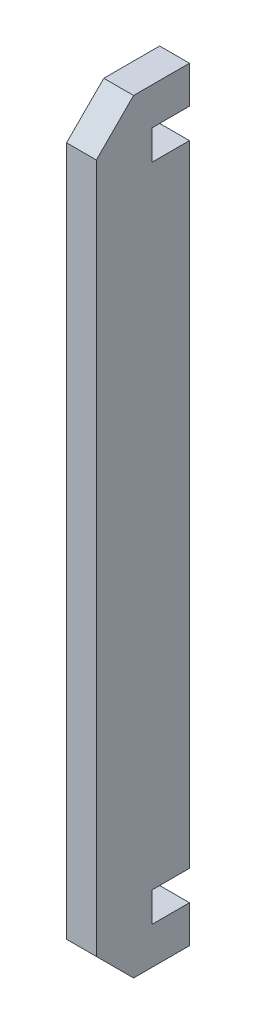
ISO-10303-21;
HEADER;
FILE_DESCRIPTION(('STEP AP214'),'2;1');
FILE_NAME('part.step','',(''),(''),'','','');
FILE_SCHEMA(('AUTOMOTIVE_DESIGN { 1 0 10303 214 1 1 1 1 }'));
ENDSEC;
DATA;
#1=APPLICATION_CONTEXT('core data for automotive mechanical design processes');
#2=APPLICATION_PROTOCOL_DEFINITION('international standard','automotive_design',2000,#1);
#3=PRODUCT_CONTEXT('',#1,'mechanical');
#4=PRODUCT('Part','Part','',(#3));
#5=PRODUCT_RELATED_PRODUCT_CATEGORY('part','',(#4));
#6=PRODUCT_DEFINITION_FORMATION('','',#4);
#7=PRODUCT_DEFINITION_CONTEXT('part definition',#1,'design');
#8=PRODUCT_DEFINITION('design','',#6,#7);
#9=PRODUCT_DEFINITION_SHAPE('','',#8);
#10=(LENGTH_UNIT() NAMED_UNIT(*) SI_UNIT(.MILLI.,.METRE.));
#11=(NAMED_UNIT(*) PLANE_ANGLE_UNIT() SI_UNIT($,.RADIAN.));
#12=(NAMED_UNIT(*) SI_UNIT($,.STERADIAN.) SOLID_ANGLE_UNIT());
#13=UNCERTAINTY_MEASURE_WITH_UNIT(LENGTH_MEASURE(1.E-05),#10,'distance_accuracy_value','');
#14=(GEOMETRIC_REPRESENTATION_CONTEXT(3) GLOBAL_UNCERTAINTY_ASSIGNED_CONTEXT((#13)) GLOBAL_UNIT_ASSIGNED_CONTEXT((#10,
#11,#12)) REPRESENTATION_CONTEXT('',''));
#15=CARTESIAN_POINT('',(0.,0.,0.));
#16=DIRECTION('',(0.,0.,1.));
#17=DIRECTION('',(1.,0.,0.));
#18=AXIS2_PLACEMENT_3D('',#15,#16,#17);
#19=CARTESIAN_POINT('',(4.,0.,0.223880597014883));
#20=DIRECTION('',(0.,0.,1.));
#21=DIRECTION('',(0.,-1.,0.));
#22=AXIS2_PLACEMENT_3D('',#19,#20,#21);
#23=PLANE('',#22);
#24=DIRECTION('',(0.,1.,0.));
#25=VECTOR('',#24,1.);
#26=CARTESIAN_POINT('',(0.,0.,0.223880597014883));
#27=LINE('',#26,#25);
#28=CARTESIAN_POINT('',(0.,-17.9216417910448,0.223880597014879));
#29=VERTEX_POINT('',#28);
#30=CARTESIAN_POINT('',(0.,66.6783582089552,0.223880597014899));
#31=VERTEX_POINT('',#30);
#32=EDGE_CURVE('E172',#29,#31,#27,.T.);
#33=ORIENTED_EDGE('',*,*,#32,.T.);
#34=DIRECTION('',(-1.,0.,0.));
#35=VECTOR('',#34,1.);
#36=CARTESIAN_POINT('',(4.,66.6783582089552,0.223880597014899));
#37=LINE('',#36,#35);
#38=CARTESIAN_POINT('',(4.,66.6783582089552,0.223880597014899));
#39=VERTEX_POINT('',#38);
#40=EDGE_CURVE('E155',#39,#31,#37,.T.);
#41=ORIENTED_EDGE('',*,*,#40,.F.);
#42=DIRECTION('',(0.,1.,0.));
#43=VECTOR('',#42,1.);
#44=CARTESIAN_POINT('',(4.,0.,0.223880597014883));
#45=LINE('',#44,#43);
#46=CARTESIAN_POINT('',(4.,-17.9216417910448,0.223880597014879));
#47=VERTEX_POINT('',#46);
#48=EDGE_CURVE('E161',#47,#39,#45,.T.);
#49=ORIENTED_EDGE('',*,*,#48,.F.);
#50=DIRECTION('',(-1.,0.,0.));
#51=VECTOR('',#50,1.);
#52=CARTESIAN_POINT('',(4.,-17.9216417910448,0.223880597014879));
#53=LINE('',#52,#51);
#54=EDGE_CURVE('E228',#47,#29,#53,.T.);
#55=ORIENTED_EDGE('',*,*,#54,.T.);
#56=EDGE_LOOP('',(#33,#41,#49,#55));
#57=FACE_BOUND('',#56,.T.);
#58=ADVANCED_FACE('F45',(#57),#23,.F.);
#59=CARTESIAN_POINT('',(4.,66.6783582089552,0.));
#60=DIRECTION('',(0.,-1.,0.));
#61=DIRECTION('',(0.,0.,-1.));
#62=AXIS2_PLACEMENT_3D('',#59,#60,#61);
#63=PLANE('',#62);
#64=DIRECTION('',(0.,0.,1.));
#65=VECTOR('',#64,1.);
#66=CARTESIAN_POINT('',(0.,66.6783582089552,0.));
#67=LINE('',#66,#65);
#68=CARTESIAN_POINT('',(0.,66.6783582089552,5.22388059701492));
#69=VERTEX_POINT('',#68);
#70=EDGE_CURVE('E255',#31,#69,#67,.T.);
#71=ORIENTED_EDGE('',*,*,#70,.T.);
#72=DIRECTION('',(-1.,0.,0.));
#73=VECTOR('',#72,1.);
#74=CARTESIAN_POINT('',(4.,66.6783582089552,5.22388059701492));
#75=LINE('',#74,#73);
#76=CARTESIAN_POINT('',(4.,66.6783582089552,5.22388059701492));
#77=VERTEX_POINT('',#76);
#78=EDGE_CURVE('E158',#77,#69,#75,.T.);
#79=ORIENTED_EDGE('',*,*,#78,.F.);
#80=DIRECTION('',(0.,0.,1.));
#81=VECTOR('',#80,1.);
#82=CARTESIAN_POINT('',(4.,66.6783582089552,0.));
#83=LINE('',#82,#81);
#84=EDGE_CURVE('E151',#39,#77,#83,.T.);
#85=ORIENTED_EDGE('',*,*,#84,.F.);
#86=ORIENTED_EDGE('',*,*,#40,.T.);
#87=EDGE_LOOP('',(#71,#79,#85,#86));
#88=FACE_BOUND('',#87,.T.);
#89=ADVANCED_FACE('F153',(#88),#63,.F.);
#90=CARTESIAN_POINT('',(4.,0.,5.22388059701492));
#91=DIRECTION('',(0.,0.,1.));
#92=DIRECTION('',(1.,0.,0.));
#93=AXIS2_PLACEMENT_3D('',#90,#91,#92);
#94=PLANE('',#93);
#95=DIRECTION('',(0.,1.,0.));
#96=VECTOR('',#95,1.);
#97=CARTESIAN_POINT('',(0.,0.,5.22388059701492));
#98=LINE('',#97,#96);
#99=CARTESIAN_POINT('',(0.,70.6783582089552,5.22388059701492));
#100=VERTEX_POINT('',#99);
#101=EDGE_CURVE('E253',#69,#100,#98,.T.);
#102=ORIENTED_EDGE('',*,*,#101,.T.);
#103=DIRECTION('',(-1.,0.,0.));
#104=VECTOR('',#103,1.);
#105=CARTESIAN_POINT('',(4.,70.6783582089552,5.22388059701492));
#106=LINE('',#105,#104);
#107=CARTESIAN_POINT('',(4.,70.6783582089552,5.22388059701492));
#108=VERTEX_POINT('',#107);
#109=EDGE_CURVE('E177',#108,#100,#106,.T.);
#110=ORIENTED_EDGE('',*,*,#109,.F.);
#111=DIRECTION('',(0.,1.,0.));
#112=VECTOR('',#111,1.);
#113=CARTESIAN_POINT('',(4.,0.,5.22388059701492));
#114=LINE('',#113,#112);
#115=EDGE_CURVE('E160',#77,#108,#114,.T.);
#116=ORIENTED_EDGE('',*,*,#115,.F.);
#117=ORIENTED_EDGE('',*,*,#78,.T.);
#118=EDGE_LOOP('',(#102,#110,#116,#117));
#119=FACE_BOUND('',#118,.T.);
#120=ADVANCED_FACE('F254',(#119),#94,.F.);
#121=CARTESIAN_POINT('',(4.,70.6783582089552,0.));
#122=DIRECTION('',(0.,-1.,0.));
#123=DIRECTION('',(0.,0.,-1.));
#124=AXIS2_PLACEMENT_3D('',#121,#122,#123);
#125=PLANE('',#124);
#126=DIRECTION('',(0.,0.,1.));
#127=VECTOR('',#126,1.);
#128=CARTESIAN_POINT('',(0.,70.6783582089552,0.));
#129=LINE('',#128,#127);
#130=CARTESIAN_POINT('',(0.,70.6783582089552,0.2238805970149));
#131=VERTEX_POINT('',#130);
#132=EDGE_CURVE('E216',#131,#100,#129,.T.);
#133=ORIENTED_EDGE('',*,*,#132,.F.);
#134=DIRECTION('',(-1.,0.,0.));
#135=VECTOR('',#134,1.);
#136=CARTESIAN_POINT('',(4.,70.6783582089552,0.2238805970149));
#137=LINE('',#136,#135);
#138=CARTESIAN_POINT('',(4.,70.6783582089552,0.2238805970149));
#139=VERTEX_POINT('',#138);
#140=EDGE_CURVE('E241',#139,#131,#137,.T.);
#141=ORIENTED_EDGE('',*,*,#140,.F.);
#142=DIRECTION('',(0.,0.,1.));
#143=VECTOR('',#142,1.);
#144=CARTESIAN_POINT('',(4.,70.6783582089552,0.));
#145=LINE('',#144,#143);
#146=EDGE_CURVE('E250',#139,#108,#145,.T.);
#147=ORIENTED_EDGE('',*,*,#146,.T.);
#148=ORIENTED_EDGE('',*,*,#109,.T.);
#149=EDGE_LOOP('',(#133,#141,#147,#148));
#150=FACE_BOUND('',#149,.T.);
#151=ADVANCED_FACE('F247',(#150),#125,.T.);
#152=CARTESIAN_POINT('',(4.,0.,0.223880597014883));
#153=DIRECTION('',(0.,0.,1.));
#154=DIRECTION('',(0.,-1.,0.));
#155=AXIS2_PLACEMENT_3D('',#152,#153,#154);
#156=PLANE('',#155);
#157=DIRECTION('',(0.,1.,0.));
#158=VECTOR('',#157,1.);
#159=CARTESIAN_POINT('',(0.,0.,0.223880597014883));
#160=LINE('',#159,#158);
#161=CARTESIAN_POINT('',(0.,75.6783582089552,0.223880597014901));
#162=VERTEX_POINT('',#161);
#163=EDGE_CURVE('E212',#131,#162,#160,.T.);
#164=ORIENTED_EDGE('',*,*,#163,.T.);
#165=DIRECTION('',(-1.,0.,0.));
#166=VECTOR('',#165,1.);
#167=CARTESIAN_POINT('',(4.,75.6783582089552,0.223880597014901));
#168=LINE('',#167,#166);
#169=CARTESIAN_POINT('',(4.,75.6783582089552,0.223880597014901));
#170=VERTEX_POINT('',#169);
#171=EDGE_CURVE('E211',#170,#162,#168,.T.);
#172=ORIENTED_EDGE('',*,*,#171,.F.);
#173=DIRECTION('',(0.,1.,0.));
#174=VECTOR('',#173,1.);
#175=CARTESIAN_POINT('',(4.,0.,0.223880597014883));
#176=LINE('',#175,#174);
#177=EDGE_CURVE('E267',#139,#170,#176,.T.);
#178=ORIENTED_EDGE('',*,*,#177,.F.);
#179=ORIENTED_EDGE('',*,*,#140,.T.);
#180=EDGE_LOOP('',(#164,#172,#178,#179));
#181=FACE_BOUND('',#180,.T.);
#182=ADVANCED_FACE('F311',(#181),#156,.F.);
#183=CARTESIAN_POINT('',(4.,75.6783582089552,0.));
#184=DIRECTION('',(0.,-1.,0.));
#185=DIRECTION('',(0.,0.,-1.));
#186=AXIS2_PLACEMENT_3D('',#183,#184,#185);
#187=PLANE('',#186);
#188=DIRECTION('',(0.,0.,1.));
#189=VECTOR('',#188,1.);
#190=CARTESIAN_POINT('',(0.,75.6783582089552,0.));
#191=LINE('',#190,#189);
#192=CARTESIAN_POINT('',(0.,75.6783582089552,7.72388059701496));
#193=VERTEX_POINT('',#192);
#194=EDGE_CURVE('E206',#162,#193,#191,.T.);
#195=ORIENTED_EDGE('',*,*,#194,.T.);
#196=DIRECTION('',(1.,0.,0.));
#197=VECTOR('',#196,1.);
#198=CARTESIAN_POINT('',(4.,75.6783582089552,7.72388059701496));
#199=LINE('',#198,#197);
#200=CARTESIAN_POINT('',(4.,75.6783582089552,7.72388059701496));
#201=VERTEX_POINT('',#200);
#202=EDGE_CURVE('E69',#193,#201,#199,.T.);
#203=ORIENTED_EDGE('',*,*,#202,.T.);
#204=DIRECTION('',(0.,0.,1.));
#205=VECTOR('',#204,1.);
#206=CARTESIAN_POINT('',(4.,75.6783582089552,0.));
#207=LINE('',#206,#205);
#208=EDGE_CURVE('E191',#170,#201,#207,.T.);
#209=ORIENTED_EDGE('',*,*,#208,.F.);
#210=ORIENTED_EDGE('',*,*,#171,.T.);
#211=EDGE_LOOP('',(#195,#203,#209,#210));
#212=FACE_BOUND('',#211,.T.);
#213=ADVANCED_FACE('F209',(#212),#187,.F.);
#214=CARTESIAN_POINT('',(4.,0.,12.7238805970149));
#215=DIRECTION('',(0.,0.,1.));
#216=DIRECTION('',(0.,-1.,0.));
#217=AXIS2_PLACEMENT_3D('',#214,#215,#216);
#218=PLANE('',#217);
#219=DIRECTION('',(0.,1.,0.));
#220=VECTOR('',#219,1.);
#221=CARTESIAN_POINT('',(4.,0.,12.7238805970149));
#222=LINE('',#221,#220);
#223=CARTESIAN_POINT('',(4.,-21.9216417910448,12.7238805970149));
#224=VERTEX_POINT('',#223);
#225=CARTESIAN_POINT('',(4.,70.6783582089552,12.7238805970149));
#226=VERTEX_POINT('',#225);
#227=EDGE_CURVE('E190',#224,#226,#222,.T.);
#228=ORIENTED_EDGE('',*,*,#227,.T.);
#229=DIRECTION('',(-1.,0.,0.));
#230=VECTOR('',#229,1.);
#231=CARTESIAN_POINT('',(0.,70.6783582089552,12.7238805970149));
#232=LINE('',#231,#230);
#233=CARTESIAN_POINT('',(0.,70.6783582089552,12.7238805970149));
#234=VERTEX_POINT('',#233);
#235=EDGE_CURVE('E175',#226,#234,#232,.T.);
#236=ORIENTED_EDGE('',*,*,#235,.T.);
#237=DIRECTION('',(0.,1.,0.));
#238=VECTOR('',#237,1.);
#239=CARTESIAN_POINT('',(0.,0.,12.7238805970149));
#240=LINE('',#239,#238);
#241=CARTESIAN_POINT('',(0.,-21.9216417910448,12.7238805970149));
#242=VERTEX_POINT('',#241);
#243=EDGE_CURVE('E207',#242,#234,#240,.T.);
#244=ORIENTED_EDGE('',*,*,#243,.F.);
#245=DIRECTION('',(1.,0.,0.));
#246=VECTOR('',#245,1.);
#247=CARTESIAN_POINT('',(4.,-21.9216417910448,12.7238805970149));
#248=LINE('',#247,#246);
#249=EDGE_CURVE('E173',#242,#224,#248,.T.);
#250=ORIENTED_EDGE('',*,*,#249,.T.);
#251=EDGE_LOOP('',(#228,#236,#244,#250));
#252=FACE_BOUND('',#251,.T.);
#253=ADVANCED_FACE('F195',(#252),#218,.T.);
#254=CARTESIAN_POINT('',(4.,-26.9216417910448,0.));
#255=DIRECTION('',(0.,-1.,0.));
#256=DIRECTION('',(0.,0.,-1.));
#257=AXIS2_PLACEMENT_3D('',#254,#255,#256);
#258=PLANE('',#257);
#259=DIRECTION('',(0.,0.,1.));
#260=VECTOR('',#259,1.);
#261=CARTESIAN_POINT('',(4.,-26.9216417910448,0.));
#262=LINE('',#261,#260);
#263=CARTESIAN_POINT('',(4.,-26.9216417910448,0.223880597014877));
#264=VERTEX_POINT('',#263);
#265=CARTESIAN_POINT('',(4.,-26.9216417910448,7.72388059701494));
#266=VERTEX_POINT('',#265);
#267=EDGE_CURVE('E199',#264,#266,#262,.T.);
#268=ORIENTED_EDGE('',*,*,#267,.T.);
#269=DIRECTION('',(-1.,0.,0.));
#270=VECTOR('',#269,1.);
#271=CARTESIAN_POINT('',(4.,-26.9216417910448,7.72388059701494));
#272=LINE('',#271,#270);
#273=CARTESIAN_POINT('',(0.,-26.9216417910448,7.72388059701494));
#274=VERTEX_POINT('',#273);
#275=EDGE_CURVE('E11',#266,#274,#272,.T.);
#276=ORIENTED_EDGE('',*,*,#275,.T.);
#277=DIRECTION('',(0.,0.,1.));
#278=VECTOR('',#277,1.);
#279=CARTESIAN_POINT('',(0.,-26.9216417910448,0.));
#280=LINE('',#279,#278);
#281=CARTESIAN_POINT('',(0.,-26.9216417910448,0.223880597014877));
#282=VERTEX_POINT('',#281);
#283=EDGE_CURVE('E214',#282,#274,#280,.T.);
#284=ORIENTED_EDGE('',*,*,#283,.F.);
#285=DIRECTION('',(-1.,0.,0.));
#286=VECTOR('',#285,1.);
#287=CARTESIAN_POINT('',(4.,-26.9216417910448,0.223880597014877));
#288=LINE('',#287,#286);
#289=EDGE_CURVE('E238',#264,#282,#288,.T.);
#290=ORIENTED_EDGE('',*,*,#289,.F.);
#291=EDGE_LOOP('',(#268,#276,#284,#290));
#292=FACE_BOUND('',#291,.T.);
#293=ADVANCED_FACE('F291',(#292),#258,.T.);
#294=CARTESIAN_POINT('',(0.,-21.9216417910448,0.223880597014878));
#295=VERTEX_POINT('',#294);
#296=EDGE_CURVE('E218',#282,#295,#160,.T.);
#297=ORIENTED_EDGE('',*,*,#296,.T.);
#298=DIRECTION('',(-1.,0.,0.));
#299=VECTOR('',#298,1.);
#300=CARTESIAN_POINT('',(4.,-21.9216417910448,0.223880597014878));
#301=LINE('',#300,#299);
#302=CARTESIAN_POINT('',(4.,-21.9216417910448,0.223880597014878));
#303=VERTEX_POINT('',#302);
#304=EDGE_CURVE('E235',#303,#295,#301,.T.);
#305=ORIENTED_EDGE('',*,*,#304,.F.);
#306=EDGE_CURVE('E264',#264,#303,#176,.T.);
#307=ORIENTED_EDGE('',*,*,#306,.F.);
#308=ORIENTED_EDGE('',*,*,#289,.T.);
#309=EDGE_LOOP('',(#297,#305,#307,#308));
#310=FACE_BOUND('',#309,.T.);
#311=ADVANCED_FACE('F289',(#310),#156,.F.);
#312=CARTESIAN_POINT('',(4.,-21.9216417910448,0.));
#313=DIRECTION('',(0.,-1.,0.));
#314=DIRECTION('',(0.,0.,-1.));
#315=AXIS2_PLACEMENT_3D('',#312,#313,#314);
#316=PLANE('',#315);
#317=DIRECTION('',(0.,0.,1.));
#318=VECTOR('',#317,1.);
#319=CARTESIAN_POINT('',(0.,-21.9216417910448,0.));
#320=LINE('',#319,#318);
#321=CARTESIAN_POINT('',(0.,-21.9216417910448,5.22388059701492));
#322=VERTEX_POINT('',#321);
#323=EDGE_CURVE('E223',#295,#322,#320,.T.);
#324=ORIENTED_EDGE('',*,*,#323,.T.);
#325=DIRECTION('',(-1.,0.,0.));
#326=VECTOR('',#325,1.);
#327=CARTESIAN_POINT('',(4.,-21.9216417910448,5.22388059701492));
#328=LINE('',#327,#326);
#329=CARTESIAN_POINT('',(4.,-21.9216417910448,5.22388059701492));
#330=VERTEX_POINT('',#329);
#331=EDGE_CURVE('E232',#330,#322,#328,.T.);
#332=ORIENTED_EDGE('',*,*,#331,.F.);
#333=DIRECTION('',(0.,0.,1.));
#334=VECTOR('',#333,1.);
#335=CARTESIAN_POINT('',(4.,-21.9216417910448,0.));
#336=LINE('',#335,#334);
#337=EDGE_CURVE('E262',#303,#330,#336,.T.);
#338=ORIENTED_EDGE('',*,*,#337,.F.);
#339=ORIENTED_EDGE('',*,*,#304,.T.);
#340=EDGE_LOOP('',(#324,#332,#338,#339));
#341=FACE_BOUND('',#340,.T.);
#342=ADVANCED_FACE('F285',(#341),#316,.F.);
#343=CARTESIAN_POINT('',(0.,-17.9216417910448,5.22388059701492));
#344=VERTEX_POINT('',#343);
#345=EDGE_CURVE('E225',#322,#344,#98,.T.);
#346=ORIENTED_EDGE('',*,*,#345,.T.);
#347=DIRECTION('',(-1.,0.,0.));
#348=VECTOR('',#347,1.);
#349=CARTESIAN_POINT('',(4.,-17.9216417910448,5.22388059701492));
#350=LINE('',#349,#348);
#351=CARTESIAN_POINT('',(4.,-17.9216417910448,5.22388059701492));
#352=VERTEX_POINT('',#351);
#353=EDGE_CURVE('E230',#352,#344,#350,.T.);
#354=ORIENTED_EDGE('',*,*,#353,.F.);
#355=EDGE_CURVE('E261',#330,#352,#114,.T.);
#356=ORIENTED_EDGE('',*,*,#355,.F.);
#357=ORIENTED_EDGE('',*,*,#331,.T.);
#358=EDGE_LOOP('',(#346,#354,#356,#357));
#359=FACE_BOUND('',#358,.T.);
#360=ADVANCED_FACE('F276',(#359),#94,.F.);
#361=CARTESIAN_POINT('',(4.,-17.9216417910448,0.));
#362=DIRECTION('',(0.,-1.,0.));
#363=DIRECTION('',(0.,0.,-1.));
#364=AXIS2_PLACEMENT_3D('',#361,#362,#363);
#365=PLANE('',#364);
#366=DIRECTION('',(0.,0.,1.));
#367=VECTOR('',#366,1.);
#368=CARTESIAN_POINT('',(0.,-17.9216417910448,0.));
#369=LINE('',#368,#367);
#370=EDGE_CURVE('E169',#29,#344,#369,.T.);
#371=ORIENTED_EDGE('',*,*,#370,.F.);
#372=ORIENTED_EDGE('',*,*,#54,.F.);
#373=DIRECTION('',(0.,0.,1.));
#374=VECTOR('',#373,1.);
#375=CARTESIAN_POINT('',(4.,-17.9216417910448,0.));
#376=LINE('',#375,#374);
#377=EDGE_CURVE('E167',#47,#352,#376,.T.);
#378=ORIENTED_EDGE('',*,*,#377,.T.);
#379=ORIENTED_EDGE('',*,*,#353,.T.);
#380=EDGE_LOOP('',(#371,#372,#378,#379));
#381=FACE_BOUND('',#380,.T.);
#382=ADVANCED_FACE('F280',(#381),#365,.T.);
#383=CARTESIAN_POINT('',(4.,0.,0.));
#384=DIRECTION('',(1.,0.,0.));
#385=DIRECTION('',(0.,0.,-1.));
#386=AXIS2_PLACEMENT_3D('',#383,#384,#385);
#387=PLANE('',#386);
#388=ORIENTED_EDGE('',*,*,#208,.T.);
#389=DIRECTION('',(0.,-0.707106781186547,0.707106781186548));
#390=VECTOR('',#389,1.);
#391=CARTESIAN_POINT('',(4.,41.7011194029851,41.7011194029851));
#392=LINE('',#391,#390);
#393=EDGE_CURVE('E54',#201,#226,#392,.T.);
#394=ORIENTED_EDGE('',*,*,#393,.T.);
#395=ORIENTED_EDGE('',*,*,#227,.F.);
#396=DIRECTION('',(0.,0.707106781186549,0.707106781186547));
#397=VECTOR('',#396,1.);
#398=CARTESIAN_POINT('',(4.,-17.3227611940298,17.3227611940299));
#399=LINE('',#398,#397);
#400=EDGE_CURVE('E61',#224,#266,#399,.F.);
#401=ORIENTED_EDGE('',*,*,#400,.T.);
#402=ORIENTED_EDGE('',*,*,#267,.F.);
#403=ORIENTED_EDGE('',*,*,#306,.T.);
#404=ORIENTED_EDGE('',*,*,#337,.T.);
#405=ORIENTED_EDGE('',*,*,#355,.T.);
#406=ORIENTED_EDGE('',*,*,#377,.F.);
#407=ORIENTED_EDGE('',*,*,#48,.T.);
#408=ORIENTED_EDGE('',*,*,#84,.T.);
#409=ORIENTED_EDGE('',*,*,#115,.T.);
#410=ORIENTED_EDGE('',*,*,#146,.F.);
#411=ORIENTED_EDGE('',*,*,#177,.T.);
#412=EDGE_LOOP('',(#388,#394,#395,#401,#402,#403,#404,#405,#406,#407,#408,#409,#410,#411));
#413=FACE_BOUND('',#412,.T.);
#414=ADVANCED_FACE('F165',(#413),#387,.T.);
#415=CARTESIAN_POINT('',(0.,0.,0.));
#416=DIRECTION('',(1.,0.,0.));
#417=DIRECTION('',(0.,0.,-1.));
#418=AXIS2_PLACEMENT_3D('',#415,#416,#417);
#419=PLANE('',#418);
#420=ORIENTED_EDGE('',*,*,#243,.T.);
#421=DIRECTION('',(0.,0.707106781186547,-0.707106781186548));
#422=VECTOR('',#421,1.);
#423=CARTESIAN_POINT('',(0.,70.6783582089552,12.7238805970149));
#424=LINE('',#423,#422);
#425=EDGE_CURVE('E185',#234,#193,#424,.T.);
#426=ORIENTED_EDGE('',*,*,#425,.T.);
#427=ORIENTED_EDGE('',*,*,#194,.F.);
#428=ORIENTED_EDGE('',*,*,#163,.F.);
#429=ORIENTED_EDGE('',*,*,#132,.T.);
#430=ORIENTED_EDGE('',*,*,#101,.F.);
#431=ORIENTED_EDGE('',*,*,#70,.F.);
#432=ORIENTED_EDGE('',*,*,#32,.F.);
#433=ORIENTED_EDGE('',*,*,#370,.T.);
#434=ORIENTED_EDGE('',*,*,#345,.F.);
#435=ORIENTED_EDGE('',*,*,#323,.F.);
#436=ORIENTED_EDGE('',*,*,#296,.F.);
#437=ORIENTED_EDGE('',*,*,#283,.T.);
#438=DIRECTION('',(0.,-0.707106781186549,-0.707106781186547));
#439=VECTOR('',#438,1.);
#440=CARTESIAN_POINT('',(0.,-26.9216417910448,7.72388059701493));
#441=LINE('',#440,#439);
#442=EDGE_CURVE('E183',#274,#242,#441,.F.);
#443=ORIENTED_EDGE('',*,*,#442,.T.);
#444=EDGE_LOOP('',(#420,#426,#427,#428,#429,#430,#431,#432,#433,#434,#435,#436,#437,#443));
#445=FACE_BOUND('',#444,.T.);
#446=ADVANCED_FACE('F204',(#445),#419,.F.);
#447=CARTESIAN_POINT('',(4.,70.6783582089552,12.7238805970149));
#448=DIRECTION('',(0.,0.707106781186548,0.707106781186547));
#449=DIRECTION('',(1.,0.,0.));
#450=AXIS2_PLACEMENT_3D('',#447,#448,#449);
#451=PLANE('',#450);
#452=ORIENTED_EDGE('',*,*,#393,.F.);
#453=ORIENTED_EDGE('',*,*,#202,.F.);
#454=ORIENTED_EDGE('',*,*,#425,.F.);
#455=ORIENTED_EDGE('',*,*,#235,.F.);
#456=EDGE_LOOP('',(#452,#453,#454,#455));
#457=FACE_BOUND('',#456,.T.);
#458=ADVANCED_FACE('F201',(#457),#451,.T.);
#459=CARTESIAN_POINT('',(4.,-26.9216417910448,7.72388059701493));
#460=DIRECTION('',(0.,0.707106781186546,-0.707106781186548));
#461=DIRECTION('',(-1.,0.,0.));
#462=AXIS2_PLACEMENT_3D('',#459,#460,#461);
#463=PLANE('',#462);
#464=ORIENTED_EDGE('',*,*,#400,.F.);
#465=ORIENTED_EDGE('',*,*,#249,.F.);
#466=ORIENTED_EDGE('',*,*,#442,.F.);
#467=ORIENTED_EDGE('',*,*,#275,.F.);
#468=EDGE_LOOP('',(#464,#465,#466,#467));
#469=FACE_BOUND('',#468,.T.);
#470=ADVANCED_FACE('F48',(#469),#463,.F.);
#471=CLOSED_SHELL('',(#58,#89,#120,#151,#182,#213,#253,#293,#311,#342,#360,#382,#414,#446,#458,#470));
#472=MANIFOLD_SOLID_BREP('B2',#471);
#473=ADVANCED_BREP_SHAPE_REPRESENTATION('',(#18,#472),#14);
#474=SHAPE_DEFINITION_REPRESENTATION(#9,#473);
ENDSEC;
END-ISO-10303-21;
